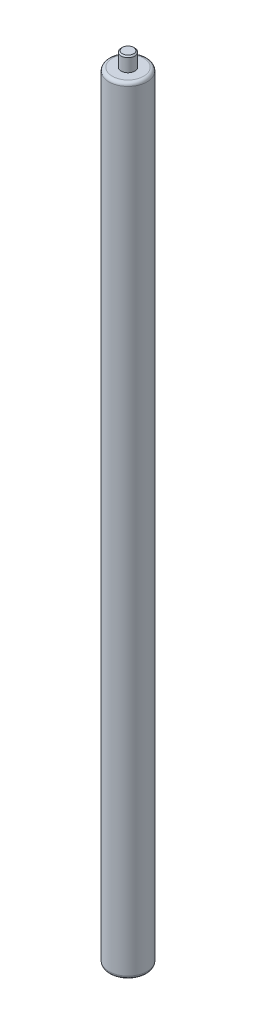
ISO-10303-21;
HEADER;
FILE_DESCRIPTION(('STEP AP214'),'2;1');
FILE_NAME('part.step','',(''),(''),'','','');
FILE_SCHEMA(('AUTOMOTIVE_DESIGN { 1 0 10303 214 1 1 1 1 }'));
ENDSEC;
DATA;
#1=APPLICATION_CONTEXT('core data for automotive mechanical design processes');
#2=APPLICATION_PROTOCOL_DEFINITION('international standard','automotive_design',2000,#1);
#3=PRODUCT_CONTEXT('',#1,'mechanical');
#4=PRODUCT('Part','Part','',(#3));
#5=PRODUCT_RELATED_PRODUCT_CATEGORY('part','',(#4));
#6=PRODUCT_DEFINITION_FORMATION('','',#4);
#7=PRODUCT_DEFINITION_CONTEXT('part definition',#1,'design');
#8=PRODUCT_DEFINITION('design','',#6,#7);
#9=PRODUCT_DEFINITION_SHAPE('','',#8);
#10=(LENGTH_UNIT() NAMED_UNIT(*) SI_UNIT(.MILLI.,.METRE.));
#11=(NAMED_UNIT(*) PLANE_ANGLE_UNIT() SI_UNIT($,.RADIAN.));
#12=(NAMED_UNIT(*) SI_UNIT($,.STERADIAN.) SOLID_ANGLE_UNIT());
#13=UNCERTAINTY_MEASURE_WITH_UNIT(LENGTH_MEASURE(1.E-05),#10,'distance_accuracy_value','');
#14=(GEOMETRIC_REPRESENTATION_CONTEXT(3) GLOBAL_UNCERTAINTY_ASSIGNED_CONTEXT((#13)) GLOBAL_UNIT_ASSIGNED_CONTEXT((#10,
#11,#12)) REPRESENTATION_CONTEXT('',''));
#15=CARTESIAN_POINT('',(0.,0.,0.));
#16=DIRECTION('',(0.,0.,1.));
#17=DIRECTION('',(1.,0.,0.));
#18=AXIS2_PLACEMENT_3D('',#15,#16,#17);
#19=CARTESIAN_POINT('',(0.,452.12,0.));
#20=DIRECTION('',(0.,-1.,0.));
#21=DIRECTION('',(0.,0.,-1.));
#22=AXIS2_PLACEMENT_3D('',#19,#20,#21);
#23=CYLINDRICAL_SURFACE('',#22,11.049);
#24=CARTESIAN_POINT('',(0.,1.90499999999999,0.));
#25=DIRECTION('',(0.,1.,0.));
#26=DIRECTION('',(0.,0.,1.));
#27=AXIS2_PLACEMENT_3D('',#24,#25,#26);
#28=CIRCLE('',#27,11.049);
#29=CARTESIAN_POINT('',(0.,1.90499999999993,-11.049));
#30=VERTEX_POINT('',#29);
#31=EDGE_CURVE('E43',#30,#30,#28,.T.);
#32=CARTESIAN_POINT('',(0.,450.215,0.));
#33=DIRECTION('',(0.,1.,0.));
#34=DIRECTION('',(0.,0.,1.));
#35=AXIS2_PLACEMENT_3D('',#32,#33,#34);
#36=CIRCLE('',#35,11.049);
#37=CARTESIAN_POINT('',(0.,450.215,-11.049));
#38=VERTEX_POINT('',#37);
#39=EDGE_CURVE('E47',#38,#38,#36,.F.);
#40=CARTESIAN_POINT('',(0.,1.90499999999993,-11.049));
#41=CARTESIAN_POINT('',(0.,6.57489583333327,-11.049));
#42=CARTESIAN_POINT('',(0.,11.2447916666666,-11.049));
#43=CARTESIAN_POINT('',(0.,20.5845833333333,-11.049));
#44=CARTESIAN_POINT('',(0.,25.2544791666666,-11.049));
#45=CARTESIAN_POINT('',(0.,34.5942708333333,-11.049));
#46=CARTESIAN_POINT('',(0.,39.2641666666666,-11.049));
#47=CARTESIAN_POINT('',(0.,48.6039583333333,-11.049));
#48=CARTESIAN_POINT('',(0.,53.2738541666666,-11.049));
#49=CARTESIAN_POINT('',(0.,62.6136458333333,-11.049));
#50=CARTESIAN_POINT('',(0.,67.2835416666666,-11.049));
#51=CARTESIAN_POINT('',(0.,76.6233333333333,-11.049));
#52=CARTESIAN_POINT('',(0.,81.2932291666666,-11.049));
#53=CARTESIAN_POINT('',(0.,90.6330208333333,-11.049));
#54=CARTESIAN_POINT('',(0.,95.3029166666666,-11.049));
#55=CARTESIAN_POINT('',(0.,104.642708333333,-11.049));
#56=CARTESIAN_POINT('',(0.,109.312604166667,-11.049));
#57=CARTESIAN_POINT('',(0.,118.652395833333,-11.049));
#58=CARTESIAN_POINT('',(0.,123.322291666667,-11.049));
#59=CARTESIAN_POINT('',(0.,132.662083333333,-11.049));
#60=CARTESIAN_POINT('',(0.,137.331979166667,-11.049));
#61=CARTESIAN_POINT('',(0.,146.671770833333,-11.049));
#62=CARTESIAN_POINT('',(0.,151.341666666667,-11.049));
#63=CARTESIAN_POINT('',(0.,160.681458333333,-11.049));
#64=CARTESIAN_POINT('',(0.,165.351354166667,-11.049));
#65=CARTESIAN_POINT('',(0.,174.691145833333,-11.049));
#66=CARTESIAN_POINT('',(0.,179.361041666667,-11.049));
#67=CARTESIAN_POINT('',(0.,188.700833333333,-11.049));
#68=CARTESIAN_POINT('',(0.,193.370729166667,-11.049));
#69=CARTESIAN_POINT('',(0.,202.710520833333,-11.049));
#70=CARTESIAN_POINT('',(0.,207.380416666667,-11.049));
#71=CARTESIAN_POINT('',(0.,216.720208333333,-11.049));
#72=CARTESIAN_POINT('',(0.,221.390104166667,-11.049));
#73=CARTESIAN_POINT('',(0.,230.729895833333,-11.049));
#74=CARTESIAN_POINT('',(0.,235.399791666667,-11.049));
#75=CARTESIAN_POINT('',(0.,244.739583333333,-11.049));
#76=CARTESIAN_POINT('',(0.,249.409479166667,-11.049));
#77=CARTESIAN_POINT('',(0.,258.749270833333,-11.049));
#78=CARTESIAN_POINT('',(0.,263.419166666667,-11.049));
#79=CARTESIAN_POINT('',(0.,272.758958333333,-11.049));
#80=CARTESIAN_POINT('',(0.,277.428854166667,-11.049));
#81=CARTESIAN_POINT('',(0.,286.768645833333,-11.049));
#82=CARTESIAN_POINT('',(0.,291.438541666667,-11.049));
#83=CARTESIAN_POINT('',(0.,300.778333333333,-11.049));
#84=CARTESIAN_POINT('',(0.,305.448229166667,-11.049));
#85=CARTESIAN_POINT('',(0.,314.788020833333,-11.049));
#86=CARTESIAN_POINT('',(0.,319.457916666667,-11.049));
#87=CARTESIAN_POINT('',(0.,328.797708333333,-11.049));
#88=CARTESIAN_POINT('',(0.,333.467604166667,-11.049));
#89=CARTESIAN_POINT('',(0.,342.807395833333,-11.049));
#90=CARTESIAN_POINT('',(0.,347.477291666667,-11.049));
#91=CARTESIAN_POINT('',(0.,356.817083333333,-11.049));
#92=CARTESIAN_POINT('',(0.,361.486979166667,-11.049));
#93=CARTESIAN_POINT('',(0.,370.826770833333,-11.049));
#94=CARTESIAN_POINT('',(0.,375.496666666667,-11.049));
#95=CARTESIAN_POINT('',(0.,384.836458333333,-11.049));
#96=CARTESIAN_POINT('',(0.,389.506354166667,-11.049));
#97=CARTESIAN_POINT('',(0.,398.846145833333,-11.049));
#98=CARTESIAN_POINT('',(0.,403.516041666667,-11.049));
#99=CARTESIAN_POINT('',(0.,412.855833333333,-11.049));
#100=CARTESIAN_POINT('',(0.,417.525729166667,-11.049));
#101=CARTESIAN_POINT('',(0.,426.865520833333,-11.049));
#102=CARTESIAN_POINT('',(0.,431.535416666667,-11.049));
#103=CARTESIAN_POINT('',(0.,440.875208333333,-11.049));
#104=CARTESIAN_POINT('',(0.,445.545104166667,-11.049));
#105=CARTESIAN_POINT('',(0.,450.215,-11.049));
#106=B_SPLINE_CURVE_WITH_KNOTS('',3,(#40,#41,#42,#43,#44,#45,#46,#47,#48,#49,#50,#51,#52,#53,
#54,#55,#56,#57,#58,#59,#60,#61,#62,#63,#64,#65,#66,#67,#68,#69,#70,#71,#72,#73,#74,#75,#76,#77,
#78,#79,#80,#81,#82,#83,#84,#85,#86,#87,#88,#89,#90,#91,#92,#93,#94,#95,#96,#97,#98,#99,#100,
#101,#102,#103,#104,#105),.UNSPECIFIED.,.F.,.F.,(4,2,2,2,2,2,2,2,2,2,2,2,2,2,2,2,2,2,2,2,2,2,2,
2,2,2,2,2,2,2,2,2,4),(0.,14.0096875,28.019375,42.0290625,56.03875,70.0484375,84.058125,
98.0678125,112.0775,126.0871875,140.096875,154.1065625,168.11625,182.1259375,196.135625,
210.1453125,224.155,238.1646875,252.174375,266.1840625,280.19375,294.2034375,308.213125,
322.2228125,336.2325,350.2421875,364.251875,378.2615625,392.27125,406.2809375,420.290625,
434.3003125,448.31),.UNSPECIFIED.);
#107=EDGE_CURVE('BSEAM32',#30,#38,#106,.T.);
#108=ORIENTED_EDGE('',*,*,#31,.T.);
#109=ORIENTED_EDGE('',*,*,#39,.T.);
#110=ORIENTED_EDGE('',*,*,#107,.T.);
#111=ORIENTED_EDGE('',*,*,#107,.F.);
#112=EDGE_LOOP('',(#108,#110,#109,#111));
#113=FACE_BOUND('',#112,.T.);
#114=ADVANCED_FACE('F32',(#113),#23,.T.);
#115=CARTESIAN_POINT('',(0.,452.12,0.));
#116=DIRECTION('',(0.,1.,0.));
#117=DIRECTION('',(0.,0.,1.));
#118=AXIS2_PLACEMENT_3D('',#115,#116,#117);
#119=PLANE('',#118);
#120=CARTESIAN_POINT('',(0.,452.12,0.));
#121=DIRECTION('',(0.,1.,0.));
#122=DIRECTION('',(0.,0.,1.));
#123=AXIS2_PLACEMENT_3D('',#120,#121,#122);
#124=CIRCLE('',#123,9.144);
#125=CARTESIAN_POINT('',(0.,452.12,9.144));
#126=VERTEX_POINT('',#125);
#127=EDGE_CURVE('E10',#126,#126,#124,.T.);
#128=ORIENTED_EDGE('',*,*,#127,.T.);
#129=EDGE_LOOP('',(#128));
#130=FACE_BOUND('',#129,.T.);
#131=CARTESIAN_POINT('',(0.,452.12,0.));
#132=DIRECTION('',(0.,1.,0.));
#133=DIRECTION('',(0.,0.,1.));
#134=AXIS2_PLACEMENT_3D('',#131,#132,#133);
#135=CIRCLE('',#134,4.);
#136=CARTESIAN_POINT('',(0.,452.12,4.));
#137=VERTEX_POINT('',#136);
#138=EDGE_CURVE('E58',#137,#137,#135,.T.);
#139=ORIENTED_EDGE('',*,*,#138,.F.);
#140=EDGE_LOOP('',(#139));
#141=FACE_BOUND('',#140,.T.);
#142=ADVANCED_FACE('F79',(#130,#141),#119,.T.);
#143=CARTESIAN_POINT('',(0.,0.,0.));
#144=DIRECTION('',(0.,1.,0.));
#145=DIRECTION('',(0.,0.,1.));
#146=AXIS2_PLACEMENT_3D('',#143,#144,#145);
#147=PLANE('',#146);
#148=CARTESIAN_POINT('',(0.,0.,0.));
#149=DIRECTION('',(0.,-1.,0.));
#150=DIRECTION('',(0.,0.,-1.));
#151=AXIS2_PLACEMENT_3D('',#148,#149,#150);
#152=CIRCLE('',#151,4.953);
#153=CARTESIAN_POINT('',(0.,0.,-4.953));
#154=VERTEX_POINT('',#153);
#155=EDGE_CURVE('E62',#154,#154,#152,.T.);
#156=ORIENTED_EDGE('',*,*,#155,.F.);
#157=EDGE_LOOP('',(#156));
#158=FACE_BOUND('',#157,.T.);
#159=CARTESIAN_POINT('',(0.,0.,0.));
#160=DIRECTION('',(0.,1.,0.));
#161=DIRECTION('',(0.,0.,1.));
#162=AXIS2_PLACEMENT_3D('',#159,#160,#161);
#163=CIRCLE('',#162,9.144);
#164=CARTESIAN_POINT('',(0.,0.,9.144));
#165=VERTEX_POINT('',#164);
#166=EDGE_CURVE('E39',#165,#165,#163,.F.);
#167=ORIENTED_EDGE('',*,*,#166,.T.);
#168=EDGE_LOOP('',(#167));
#169=FACE_BOUND('',#168,.T.);
#170=ADVANCED_FACE('F76',(#158,#169),#147,.F.);
#171=CARTESIAN_POINT('',(0.,460.502,0.));
#172=DIRECTION('',(0.,-1.,0.));
#173=DIRECTION('',(0.,0.,-1.));
#174=AXIS2_PLACEMENT_3D('',#171,#172,#173);
#175=CYLINDRICAL_SURFACE('',#174,4.);
#176=CARTESIAN_POINT('',(0.,459.74,0.));
#177=DIRECTION('',(0.,1.,0.));
#178=DIRECTION('',(0.,0.,1.));
#179=AXIS2_PLACEMENT_3D('',#176,#177,#178);
#180=CIRCLE('',#179,4.);
#181=CARTESIAN_POINT('',(0.,459.74,4.));
#182=VERTEX_POINT('',#181);
#183=EDGE_CURVE('E52',#182,#182,#180,.F.);
#184=ORIENTED_EDGE('',*,*,#183,.T.);
#185=EDGE_LOOP('',(#184));
#186=FACE_BOUND('',#185,.T.);
#187=ORIENTED_EDGE('',*,*,#138,.T.);
#188=EDGE_LOOP('',(#187));
#189=FACE_BOUND('',#188,.T.);
#190=ADVANCED_FACE('F78',(#186,#189),#175,.T.);
#191=CARTESIAN_POINT('',(0.,460.502,0.));
#192=DIRECTION('',(0.,1.,0.));
#193=DIRECTION('',(0.,0.,1.));
#194=AXIS2_PLACEMENT_3D('',#191,#192,#193);
#195=PLANE('',#194);
#196=CARTESIAN_POINT('',(0.,460.502,0.));
#197=DIRECTION('',(0.,1.,0.));
#198=DIRECTION('',(0.,0.,1.));
#199=AXIS2_PLACEMENT_3D('',#196,#197,#198);
#200=CIRCLE('',#199,3.23799999999996);
#201=CARTESIAN_POINT('',(0.,460.502,3.23799999999996));
#202=VERTEX_POINT('',#201);
#203=EDGE_CURVE('E55',#202,#202,#200,.T.);
#204=ORIENTED_EDGE('',*,*,#203,.T.);
#205=EDGE_LOOP('',(#204));
#206=FACE_BOUND('',#205,.T.);
#207=ADVANCED_FACE('F85',(#206),#195,.T.);
#208=CARTESIAN_POINT('',(0.,460.502,0.));
#209=DIRECTION('',(0.,-1.,0.));
#210=DIRECTION('',(0.,0.,-1.));
#211=AXIS2_PLACEMENT_3D('',#208,#209,#210);
#212=CONICAL_SURFACE('',#211,3.23799999999996,0.785398163397482);
#213=ORIENTED_EDGE('',*,*,#183,.F.);
#214=EDGE_LOOP('',(#213));
#215=FACE_BOUND('',#214,.T.);
#216=ORIENTED_EDGE('',*,*,#203,.F.);
#217=EDGE_LOOP('',(#216));
#218=FACE_BOUND('',#217,.T.);
#219=ADVANCED_FACE('F96',(#215,#218),#212,.T.);
#220=CARTESIAN_POINT('',(0.,1.90499999999999,0.));
#221=DIRECTION('',(0.,1.,0.));
#222=DIRECTION('',(0.,0.,1.));
#223=AXIS2_PLACEMENT_3D('',#220,#221,#222);
#224=TOROIDAL_SURFACE('',#223,9.144,1.905);
#225=ORIENTED_EDGE('',*,*,#166,.F.);
#226=EDGE_LOOP('',(#225));
#227=FACE_BOUND('',#226,.T.);
#228=ORIENTED_EDGE('',*,*,#31,.F.);
#229=EDGE_LOOP('',(#228));
#230=FACE_BOUND('',#229,.T.);
#231=ADVANCED_FACE('F98',(#227,#230),#224,.T.);
#232=CARTESIAN_POINT('',(0.,450.215,0.));
#233=DIRECTION('',(0.,1.,0.));
#234=DIRECTION('',(0.,0.,1.));
#235=AXIS2_PLACEMENT_3D('',#232,#233,#234);
#236=TOROIDAL_SURFACE('',#235,9.144,1.905);
#237=ORIENTED_EDGE('',*,*,#39,.F.);
#238=EDGE_LOOP('',(#237));
#239=FACE_BOUND('',#238,.T.);
#240=ORIENTED_EDGE('',*,*,#127,.F.);
#241=EDGE_LOOP('',(#240));
#242=FACE_BOUND('',#241,.T.);
#243=ADVANCED_FACE('F34',(#239,#242),#236,.T.);
#244=CARTESIAN_POINT('',(0.,431.8,0.));
#245=DIRECTION('',(0.,-1.,0.));
#246=DIRECTION('',(0.,0.,-1.));
#247=AXIS2_PLACEMENT_3D('',#244,#245,#246);
#248=CYLINDRICAL_SURFACE('',#247,4.953);
#249=CARTESIAN_POINT('',(0.,431.8,0.));
#250=DIRECTION('',(0.,-1.,0.));
#251=DIRECTION('',(0.,0.,-1.));
#252=AXIS2_PLACEMENT_3D('',#249,#250,#251);
#253=CIRCLE('',#252,4.953);
#254=CARTESIAN_POINT('',(0.,431.8,-4.953));
#255=VERTEX_POINT('',#254);
#256=EDGE_CURVE('E61',#255,#255,#253,.T.);
#257=ORIENTED_EDGE('',*,*,#256,.F.);
#258=EDGE_LOOP('',(#257));
#259=FACE_BOUND('',#258,.T.);
#260=ORIENTED_EDGE('',*,*,#155,.T.);
#261=EDGE_LOOP('',(#260));
#262=FACE_BOUND('',#261,.T.);
#263=ADVANCED_FACE('F70',(#259,#262),#248,.F.);
#264=CARTESIAN_POINT('',(0.,431.8,0.));
#265=DIRECTION('',(0.,-1.,0.));
#266=DIRECTION('',(0.,0.,-1.));
#267=AXIS2_PLACEMENT_3D('',#264,#265,#266);
#268=PLANE('',#267);
#269=ORIENTED_EDGE('',*,*,#256,.T.);
#270=EDGE_LOOP('',(#269));
#271=FACE_BOUND('',#270,.T.);
#272=ADVANCED_FACE('F68',(#271),#268,.T.);
#273=CLOSED_SHELL('',(#114,#142,#170,#190,#207,#219,#231,#243,#263,#272));
#274=MANIFOLD_SOLID_BREP('B2',#273);
#275=ADVANCED_BREP_SHAPE_REPRESENTATION('',(#18,#274),#14);
#276=SHAPE_DEFINITION_REPRESENTATION(#9,#275);
ENDSEC;
END-ISO-10303-21;
